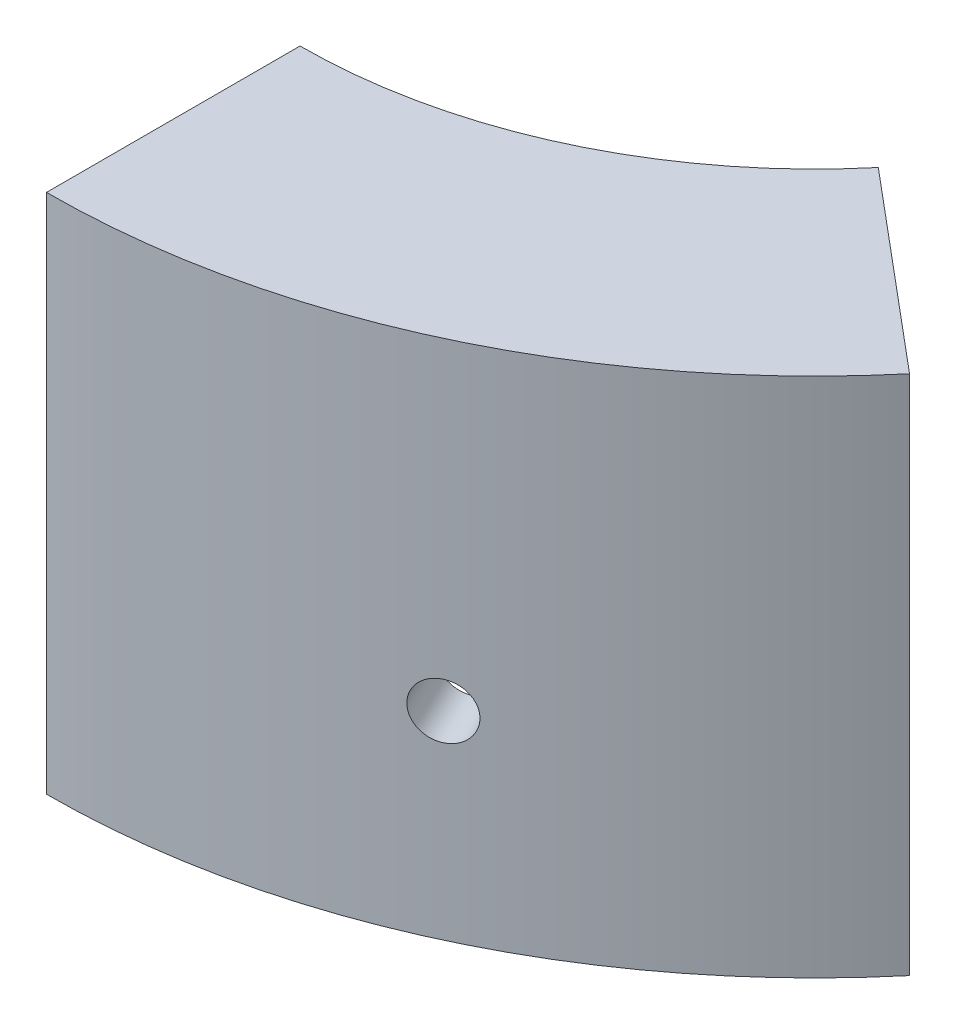
ISO-10303-21;
HEADER;
FILE_DESCRIPTION(('STEP AP214'),'2;1');
FILE_NAME('part.step','',(''),(''),'','','');
FILE_SCHEMA(('AUTOMOTIVE_DESIGN { 1 0 10303 214 1 1 1 1 }'));
ENDSEC;
DATA;
#1=APPLICATION_CONTEXT('core data for automotive mechanical design processes');
#2=APPLICATION_PROTOCOL_DEFINITION('international standard','automotive_design',2000,#1);
#3=PRODUCT_CONTEXT('',#1,'mechanical');
#4=PRODUCT('Part','Part','',(#3));
#5=PRODUCT_RELATED_PRODUCT_CATEGORY('part','',(#4));
#6=PRODUCT_DEFINITION_FORMATION('','',#4);
#7=PRODUCT_DEFINITION_CONTEXT('part definition',#1,'design');
#8=PRODUCT_DEFINITION('design','',#6,#7);
#9=PRODUCT_DEFINITION_SHAPE('','',#8);
#10=(LENGTH_UNIT() NAMED_UNIT(*) SI_UNIT(.MILLI.,.METRE.));
#11=(NAMED_UNIT(*) PLANE_ANGLE_UNIT() SI_UNIT($,.RADIAN.));
#12=(NAMED_UNIT(*) SI_UNIT($,.STERADIAN.) SOLID_ANGLE_UNIT());
#13=UNCERTAINTY_MEASURE_WITH_UNIT(LENGTH_MEASURE(1.E-05),#10,'distance_accuracy_value','');
#14=(GEOMETRIC_REPRESENTATION_CONTEXT(3) GLOBAL_UNCERTAINTY_ASSIGNED_CONTEXT((#13)) GLOBAL_UNIT_ASSIGNED_CONTEXT((#10,
#11,#12)) REPRESENTATION_CONTEXT('',''));
#15=CARTESIAN_POINT('',(0.,0.,0.));
#16=DIRECTION('',(0.,0.,1.));
#17=DIRECTION('',(1.,0.,0.));
#18=AXIS2_PLACEMENT_3D('',#15,#16,#17);
#19=CARTESIAN_POINT('',(0.,11.25,0.));
#20=DIRECTION('',(0.,-1.,0.));
#21=DIRECTION('',(0.,0.,-1.));
#22=AXIS2_PLACEMENT_3D('',#19,#20,#21);
#23=CYLINDRICAL_SURFACE('',#22,60.);
#24=DIRECTION('',(0.,-1.,0.));
#25=VECTOR('',#24,1.);
#26=CARTESIAN_POINT('',(0.,11.25,60.));
#27=LINE('',#26,#25);
#28=CARTESIAN_POINT('',(0.,11.25,60.));
#29=VERTEX_POINT('',#28);
#30=CARTESIAN_POINT('',(0.,-29.45,60.));
#31=VERTEX_POINT('',#30);
#32=EDGE_CURVE('E188',#29,#31,#27,.T.);
#33=ORIENTED_EDGE('',*,*,#32,.T.);
#34=CARTESIAN_POINT('',(0.,-29.45,0.));
#35=DIRECTION('',(0.,-1.,0.));
#36=DIRECTION('',(0.,0.,-1.));
#37=AXIS2_PLACEMENT_3D('',#34,#35,#36);
#38=CIRCLE('',#37,60.);
#39=CARTESIAN_POINT('',(45.9626665871388,-29.45,38.5672565811923));
#40=VERTEX_POINT('',#39);
#41=EDGE_CURVE('E145',#40,#31,#38,.T.);
#42=ORIENTED_EDGE('',*,*,#41,.F.);
#43=DIRECTION('',(0.,-1.,0.));
#44=VECTOR('',#43,1.);
#45=CARTESIAN_POINT('',(45.9626665871387,11.25,38.5672565811923));
#46=LINE('',#45,#44);
#47=CARTESIAN_POINT('',(45.9626665871387,11.25,38.5672565811923));
#48=VERTEX_POINT('',#47);
#49=EDGE_CURVE('E141',#48,#40,#46,.T.);
#50=ORIENTED_EDGE('',*,*,#49,.F.);
#51=CARTESIAN_POINT('',(0.,11.25,0.));
#52=DIRECTION('',(0.,1.,0.));
#53=DIRECTION('',(0.,0.,1.));
#54=AXIS2_PLACEMENT_3D('',#51,#52,#53);
#55=CIRCLE('',#54,60.);
#56=EDGE_CURVE('E166',#29,#48,#55,.T.);
#57=ORIENTED_EDGE('',*,*,#56,.F.);
#58=EDGE_LOOP('',(#33,#42,#50,#57));
#59=FACE_BOUND('',#58,.T.);
#60=CARTESIAN_POINT('',(23.3922491254643,-13.95,55.2521735396194));
#61=CARTESIAN_POINT('',(23.3922541854339,-14.0707248420507,55.2521717531925));
#62=CARTESIAN_POINT('',(23.4016513651294,-14.1915362342641,55.2481958127734));
#63=CARTESIAN_POINT('',(23.4389939015818,-14.429828956038,55.2323633417633));
#64=CARTESIAN_POINT('',(23.4669613419157,-14.5473061469481,55.220497428468));
#65=CARTESIAN_POINT('',(23.5406066530726,-14.7754439014427,55.1891423282363));
#66=CARTESIAN_POINT('',(23.5862757723697,-14.8861078021664,55.1696569082626));
#67=CARTESIAN_POINT('',(23.6939568640016,-15.0975036637949,55.1234961061498));
#68=CARTESIAN_POINT('',(23.7559648785194,-15.198238021852,55.0968224651981));
#69=CARTESIAN_POINT('',(23.8945332200248,-15.3870054728275,55.0368691597757));
#70=CARTESIAN_POINT('',(23.9711008917726,-15.4750321156179,55.003586160773));
#71=CARTESIAN_POINT('',(24.1365230414772,-15.635830823503,54.9311968676657));
#72=CARTESIAN_POINT('',(24.2253780114072,-15.7086022774988,54.8920903403871));
#73=CARTESIAN_POINT('',(24.4128028804114,-15.8368381175184,54.8089915117414));
#74=CARTESIAN_POINT('',(24.5113752076527,-15.8922981632809,54.7649979888648));
#75=CARTESIAN_POINT('',(24.7153552405868,-15.9843088158283,54.6732449126882));
#76=CARTESIAN_POINT('',(24.8207629130422,-16.0208595145535,54.6254853777004));
#77=CARTESIAN_POINT('',(25.0353281996155,-16.0739987719034,54.5274815035325));
#78=CARTESIAN_POINT('',(25.1444841696664,-16.0905959702895,54.4772382496084));
#79=CARTESIAN_POINT('',(25.363466769589,-16.1033837281213,54.3756298426833));
#80=CARTESIAN_POINT('',(25.4732933961575,-16.0995743879957,54.324264695205));
#81=CARTESIAN_POINT('',(25.6904517219533,-16.0716644472431,54.2219060594013));
#82=CARTESIAN_POINT('',(25.7977845433253,-16.0475731620519,54.170912411291));
#83=CARTESIAN_POINT('',(26.006992899415,-15.9797976151706,54.0707848874392));
#84=CARTESIAN_POINT('',(26.1088684195068,-15.9361133009727,54.0216510166822));
#85=CARTESIAN_POINT('',(26.3043498333329,-15.8303810610633,53.9267373565924));
#86=CARTESIAN_POINT('',(26.3979538006695,-15.7683288721379,53.8809583490097));
#87=CARTESIAN_POINT('',(26.5742832138732,-15.6276254653688,53.7942110526802));
#88=CARTESIAN_POINT('',(26.6570086223979,-15.5489741905486,53.7532427804469));
#89=CARTESIAN_POINT('',(26.8093585088674,-15.3772525227586,53.6774213048454));
#90=CARTESIAN_POINT('',(26.8789755951441,-15.2841740480264,53.6425715524008));
#91=CARTESIAN_POINT('',(27.0031533694194,-15.0862686136449,53.580169404268));
#92=CARTESIAN_POINT('',(27.0577140546456,-14.9814416518322,53.5526170099235));
#93=CARTESIAN_POINT('',(27.1502977204834,-14.76301022928,53.5057383827682));
#94=CARTESIAN_POINT('',(27.188320455097,-14.649405638005,53.4864122723213));
#95=CARTESIAN_POINT('',(27.2467957832979,-14.4166458929549,53.4566479052023));
#96=CARTESIAN_POINT('',(27.2672484449549,-14.2974907606855,53.4462096140972));
#97=CARTESIAN_POINT('',(27.2900232689762,-14.05708331066,53.4345842785768));
#98=CARTESIAN_POINT('',(27.2923555089991,-13.9358321961957,53.4333920919483));
#99=CARTESIAN_POINT('',(27.2788529381853,-13.6946122999907,53.4402866537407));
#100=CARTESIAN_POINT('',(27.263018157751,-13.5746435161043,53.4483733866334));
#101=CARTESIAN_POINT('',(27.2136166684765,-13.3394253603243,53.4735432535675));
#102=CARTESIAN_POINT('',(27.1800545523551,-13.2241747743903,53.4906240574616));
#103=CARTESIAN_POINT('',(27.0961095525794,-13.0016272536743,53.5331957681874));
#104=CARTESIAN_POINT('',(27.0457266197751,-12.894330342134,53.5586866995931));
#105=CARTESIAN_POINT('',(26.929479694029,-12.6906838732884,53.6172299205547));
#106=CARTESIAN_POINT('',(26.8636088615042,-12.5943391805383,53.6502855505705));
#107=CARTESIAN_POINT('',(26.7181903019912,-12.4153809036256,53.7228526098402));
#108=CARTESIAN_POINT('',(26.6386425275199,-12.3327673671364,53.7623640615071));
#109=CARTESIAN_POINT('',(26.4680066288881,-12.1835787012585,53.8465752296335));
#110=CARTESIAN_POINT('',(26.3769132852548,-12.1170108654874,53.8912772918713));
#111=CARTESIAN_POINT('',(26.1857261034243,-12.0018530746926,53.9844333222458));
#112=CARTESIAN_POINT('',(26.0856322900676,-11.9532630700535,54.0328872800275));
#113=CARTESIAN_POINT('',(25.8792526677646,-11.8754530241962,54.1320364768231));
#114=CARTESIAN_POINT('',(25.772968371504,-11.8462282723728,54.1827311675749));
#115=CARTESIAN_POINT('',(25.5571679252394,-11.8079628745986,54.2848543488288));
#116=CARTESIAN_POINT('',(25.4476517817606,-11.7989221878986,54.3362828378491));
#117=CARTESIAN_POINT('',(25.22855067912,-11.8012820814146,54.4383580677768));
#118=CARTESIAN_POINT('',(25.1189657931168,-11.8126711877716,54.4890052313837));
#119=CARTESIAN_POINT('',(24.9027912327665,-11.8555437355981,54.5881409727783));
#120=CARTESIAN_POINT('',(24.7962015642937,-11.8870272164737,54.6366295463327));
#121=CARTESIAN_POINT('',(24.5890790970899,-11.9691929072669,54.7301572492786));
#122=CARTESIAN_POINT('',(24.4885463901186,-12.0198754079545,54.775196326415));
#123=CARTESIAN_POINT('',(24.2964509051454,-12.1389974023433,54.8606738936362));
#124=CARTESIAN_POINT('',(24.2048878147176,-12.2074362772588,54.9011125439692));
#125=CARTESIAN_POINT('',(24.0333533285727,-12.3601654899175,54.9764196972454));
#126=CARTESIAN_POINT('',(23.9533872218165,-12.444463020206,55.0112856594244));
#127=CARTESIAN_POINT('',(23.8074220173936,-12.6265269797352,55.0746130780009));
#128=CARTESIAN_POINT('',(23.741426377667,-12.7242967337284,55.1030729488865));
#129=CARTESIAN_POINT('',(23.6253342186177,-12.9305772731139,55.1529472524422));
#130=CARTESIAN_POINT('',(23.5752492183618,-13.0390957662096,55.1743565810336));
#131=CARTESIAN_POINT('',(23.4925766984614,-13.2636557336775,55.2096085748595));
#132=CARTESIAN_POINT('',(23.4599683610407,-13.3796880721617,55.2234602429517));
#133=CARTESIAN_POINT('',(23.4218401466654,-13.5720421027067,55.2396383125264));
#134=CARTESIAN_POINT('',(23.4107580872576,-13.6471158642979,55.2443342925273));
#135=CARTESIAN_POINT('',(23.395960986367,-13.7981149961081,55.250602467416));
#136=CARTESIAN_POINT('',(23.3922459417497,-13.8740403659648,55.2521746636328));
#137=CARTESIAN_POINT('',(23.3922491254643,-13.95,55.2521735396194));
#138=B_SPLINE_CURVE_WITH_KNOTS('',3,(#60,#61,#62,#63,#64,#65,#66,#67,#68,#69,#70,#71,#72,#73,
#74,#75,#76,#77,#78,#79,#80,#81,#82,#83,#84,#85,#86,#87,#88,#89,#90,#91,#92,#93,#94,#95,#96,#97,
#98,#99,#100,#101,#102,#103,#104,#105,#106,#107,#108,#109,#110,#111,#112,#113,#114,#115,#116,
#117,#118,#119,#120,#121,#122,#123,#124,#125,#126,#127,#128,#129,#130,#131,#132,#133,#134,#135,
#136,#137),.UNSPECIFIED.,.T.,.F.,(4,2,2,2,2,2,2,2,2,2,2,2,2,2,2,2,2,2,2,2,2,2,2,2,2,2,2,2,2,2,2,
2,2,2,2,2,2,2,4),(0.,0.361897258983271,0.724225655357458,1.08637514835407,1.44843699736979,
1.81068197887757,2.17294146857741,2.53529171001089,2.89764018962249,3.25983171766565,
3.62202146322321,3.98404494682679,4.34606940062871,4.70817794687758,5.0702877360895,
5.43260110831141,5.79491454724963,6.15723337532553,6.51955079970539,6.88166670709438,
7.24378200848347,7.60580354064339,7.96782613063113,8.3300088940218,8.69219291485194,
9.05454125827568,9.41688860167997,9.77914777156539,10.1414062100911,10.5034612593326,
10.8655170185841,11.2275782614049,11.5896268885744,11.9518401171281,12.314142895364,
12.676707380773,13.0388390228668,13.2665435663525,13.4942480129583),.UNSPECIFIED.);
#139=CARTESIAN_POINT('',(23.3922491254643,-13.95,55.2521735396194));
#140=VERTEX_POINT('',#139);
#141=EDGE_CURVE('E152',#140,#140,#138,.T.);
#142=ORIENTED_EDGE('',*,*,#141,.F.);
#143=EDGE_LOOP('',(#142));
#144=FACE_BOUND('',#143,.T.);
#145=ADVANCED_FACE('F39',(#59,#144),#23,.T.);
#146=CARTESIAN_POINT('',(0.,-29.45,0.));
#147=DIRECTION('',(0.,1.,0.));
#148=DIRECTION('',(0.,0.,1.));
#149=AXIS2_PLACEMENT_3D('',#146,#147,#148);
#150=CYLINDRICAL_SURFACE('',#149,55.2);
#151=CARTESIAN_POINT('',(0.,6.25,0.));
#152=DIRECTION('',(0.,-1.,0.));
#153=DIRECTION('',(0.,0.,-1.));
#154=AXIS2_PLACEMENT_3D('',#151,#152,#153);
#155=CIRCLE('',#154,55.2);
#156=CARTESIAN_POINT('',(42.2856532601677,6.25,35.4818760546969));
#157=VERTEX_POINT('',#156);
#158=CARTESIAN_POINT('',(0.,6.25,55.2));
#159=VERTEX_POINT('',#158);
#160=EDGE_CURVE('E131',#157,#159,#155,.T.);
#161=ORIENTED_EDGE('',*,*,#160,.F.);
#162=DIRECTION('',(0.,1.,0.));
#163=VECTOR('',#162,1.);
#164=CARTESIAN_POINT('',(42.2856532601677,-29.45,35.4818760546969));
#165=LINE('',#164,#163);
#166=CARTESIAN_POINT('',(42.2856532601677,-29.45,35.4818760546969));
#167=VERTEX_POINT('',#166);
#168=EDGE_CURVE('E124',#167,#157,#165,.T.);
#169=ORIENTED_EDGE('',*,*,#168,.F.);
#170=CARTESIAN_POINT('',(0.,-29.45,0.));
#171=DIRECTION('',(0.,-1.,0.));
#172=DIRECTION('',(0.,0.,-1.));
#173=AXIS2_PLACEMENT_3D('',#170,#171,#172);
#174=CIRCLE('',#173,55.2);
#175=CARTESIAN_POINT('',(0.,-29.45,55.2));
#176=VERTEX_POINT('',#175);
#177=EDGE_CURVE('E129',#167,#176,#174,.T.);
#178=ORIENTED_EDGE('',*,*,#177,.T.);
#179=DIRECTION('',(0.,1.,0.));
#180=VECTOR('',#179,1.);
#181=CARTESIAN_POINT('',(0.,-29.45,55.2));
#182=LINE('',#181,#180);
#183=EDGE_CURVE('E134',#176,#159,#182,.T.);
#184=ORIENTED_EDGE('',*,*,#183,.T.);
#185=EDGE_LOOP('',(#161,#169,#178,#184));
#186=FACE_BOUND('',#185,.T.);
#187=CARTESIAN_POINT('',(21.362264364066,-13.95,50.898857170272));
#188=CARTESIAN_POINT('',(21.3622694405158,-14.0707172908338,50.8988554256321));
#189=CARTESIAN_POINT('',(21.3716789911995,-14.1915209472526,50.8949090210859));
#190=CARTESIAN_POINT('',(21.4090693215218,-14.4297978923482,50.8791916819157));
#191=CARTESIAN_POINT('',(21.4370721682093,-14.5472670505989,50.8674114498586));
#192=CARTESIAN_POINT('',(21.5108063948959,-14.7753886985463,50.8362744564914));
#193=CARTESIAN_POINT('',(21.556528961326,-14.8860445454403,50.8169214617335));
#194=CARTESIAN_POINT('',(21.6643282349254,-15.0974258952511,50.7710576658738));
#195=CARTESIAN_POINT('',(21.726401000763,-15.1981537833423,50.7445485897579));
#196=CARTESIAN_POINT('',(21.8651074100081,-15.386918079417,50.6849362480143));
#197=CARTESIAN_POINT('',(21.9417494579048,-15.4749471100826,50.6518291757064));
#198=CARTESIAN_POINT('',(22.1073176286763,-15.6357523274736,50.5797849021829));
#199=CARTESIAN_POINT('',(22.1962442451878,-15.7085279009658,50.5408474666776));
#200=CARTESIAN_POINT('',(22.3838065423846,-15.8367769812635,50.4580588232859));
#201=CARTESIAN_POINT('',(22.4824451223515,-15.8922453006613,50.4142061475244));
#202=CARTESIAN_POINT('',(22.6865409113032,-15.9842718698095,50.3226922596357));
#203=CARTESIAN_POINT('',(22.791998083599,-16.0208302213001,50.2750310680008));
#204=CARTESIAN_POINT('',(23.0066314595807,-16.0739811439652,50.1771741441197));
#205=CARTESIAN_POINT('',(23.1158057314189,-16.090583928341,50.126979722092));
#206=CARTESIAN_POINT('',(23.3347991188611,-16.1033839191848,50.0254107089069));
#207=CARTESIAN_POINT('',(23.4446182309236,-16.0995812376133,49.9740361242263));
#208=CARTESIAN_POINT('',(23.6617267213326,-16.0716867802583,49.8716060703064));
#209=CARTESIAN_POINT('',(23.7690174395056,-16.04760601046,49.8205504430922));
#210=CARTESIAN_POINT('',(23.9781204132354,-15.9798559848806,49.7202493672024));
#211=CARTESIAN_POINT('',(24.0799326525108,-15.9361866708882,49.6710039239064));
#212=CARTESIAN_POINT('',(24.2752775540777,-15.8304865683802,49.5758279947255));
#213=CARTESIAN_POINT('',(24.3688079378394,-15.7684507470791,49.5298984217509));
#214=CARTESIAN_POINT('',(24.5449845787538,-15.6277823033014,49.4428296484158));
#215=CARTESIAN_POINT('',(24.6276307909703,-15.5491496123071,49.4016904678329));
#216=CARTESIAN_POINT('',(24.7798343877172,-15.3774572583098,49.3255215086198));
#217=CARTESIAN_POINT('',(24.849383042005,-15.2843880474035,49.2904958060887));
#218=CARTESIAN_POINT('',(24.9734345471749,-15.0864981667477,49.2277606111358));
#219=CARTESIAN_POINT('',(25.0279373950865,-14.981677494678,49.2000511201583));
#220=CARTESIAN_POINT('',(25.120423476875,-14.763254589533,49.1528944476081));
#221=CARTESIAN_POINT('',(25.1584064139596,-14.6496521987308,49.1334474144767));
#222=CARTESIAN_POINT('',(25.216825013252,-14.4168931317498,49.1034909472003));
#223=CARTESIAN_POINT('',(25.2372607556765,-14.2977364809648,49.0929814721975));
#224=CARTESIAN_POINT('',(25.2600260401029,-14.0573351819678,49.0812719054578));
#225=CARTESIAN_POINT('',(25.2623674707566,-13.9360919572149,49.0800657011189));
#226=CARTESIAN_POINT('',(25.2489123611905,-13.6948854804683,49.0869889035784));
#227=CARTESIAN_POINT('',(25.2331158569941,-13.574922225933,49.0951182918356));
#228=CARTESIAN_POINT('',(25.1838184577965,-13.339718375219,49.1204239319036));
#229=CARTESIAN_POINT('',(25.1503229870618,-13.2244763437634,49.1375974119335));
#230=CARTESIAN_POINT('',(25.0665337704626,-13.0019421093365,49.1803932988871));
#231=CARTESIAN_POINT('',(25.0162399662586,-12.8946499339761,49.2060157351536));
#232=CARTESIAN_POINT('',(24.9001810184495,-12.690999539408,49.2648475496869));
#233=CARTESIAN_POINT('',(24.8344078033248,-12.5946470635407,49.2980608858593));
#234=CARTESIAN_POINT('',(24.6891866292014,-12.4156688832327,49.3709494187668));
#235=CARTESIAN_POINT('',(24.6097386150886,-12.3330432341184,49.4106246415456));
#236=CARTESIAN_POINT('',(24.4392869135116,-12.1838194413456,49.4951542324858));
#237=CARTESIAN_POINT('',(24.348277051962,-12.1172299164808,49.5400113666452));
#238=CARTESIAN_POINT('',(24.157237498651,-12.0020275133764,49.6334480778319));
#239=CARTESIAN_POINT('',(24.0572078345509,-11.9534145800098,49.6820276434435));
#240=CARTESIAN_POINT('',(23.8509347435121,-11.8755604131166,49.781382084593));
#241=CARTESIAN_POINT('',(23.7446931082972,-11.8463136235015,49.8321563260278));
#242=CARTESIAN_POINT('',(23.5289482098183,-11.8080037451981,49.9343853426438));
#243=CARTESIAN_POINT('',(23.4194449554035,-11.7989406017547,49.9858401159784));
#244=CARTESIAN_POINT('',(23.2003503259431,-11.8012559096318,50.0879061311319));
#245=CARTESIAN_POINT('',(23.0907590574566,-11.8126208120851,50.1385179095972));
#246=CARTESIAN_POINT('',(22.874542823071,-11.8554416696801,50.2375301448695));
#247=CARTESIAN_POINT('',(22.7679178629521,-11.8868976639688,50.2859305973678));
#248=CARTESIAN_POINT('',(22.5607000357985,-11.969005384266,50.3792391456441));
#249=CARTESIAN_POINT('',(22.4601072531721,-12.0196573788116,50.4241471925556));
#250=CARTESIAN_POINT('',(22.2678724858564,-12.1387160718354,50.5093350047404));
#251=CARTESIAN_POINT('',(22.1762301965425,-12.2071221657736,50.5496149275374));
#252=CARTESIAN_POINT('',(22.0045167398937,-12.3597926530076,50.6245991794193));
#253=CARTESIAN_POINT('',(21.9244520333264,-12.4440658408754,50.6593003965548));
#254=CARTESIAN_POINT('',(21.7782890954002,-12.6260847085943,50.7223074909036));
#255=CARTESIAN_POINT('',(21.7121943185973,-12.7238337109633,50.7506117863728));
#256=CARTESIAN_POINT('',(21.5959097870859,-12.9300825186774,50.8002036647812));
#257=CARTESIAN_POINT('',(21.54573227728,-13.0385905169322,50.8214858462216));
#258=CARTESIAN_POINT('',(21.4628934933082,-13.2631362674082,50.8565260806417));
#259=CARTESIAN_POINT('',(21.4302114078631,-13.3791648885453,50.8702930735277));
#260=CARTESIAN_POINT('',(21.3919671505231,-13.5716015509966,50.8863830453759));
#261=CARTESIAN_POINT('',(21.3808433136291,-13.6467614986251,50.8910562393931));
#262=CARTESIAN_POINT('',(21.3659903232497,-13.7979362058161,50.8972938505956));
#263=CARTESIAN_POINT('',(21.3622611660229,-13.8739509649459,50.8988582693539));
#264=CARTESIAN_POINT('',(21.362264364066,-13.95,50.898857170272));
#265=B_SPLINE_CURVE_WITH_KNOTS('',3,(#187,#188,#189,#190,#191,#192,#193,#194,#195,#196,#197,
#198,#199,#200,#201,#202,#203,#204,#205,#206,#207,#208,#209,#210,#211,#212,#213,#214,#215,#216,
#217,#218,#219,#220,#221,#222,#223,#224,#225,#226,#227,#228,#229,#230,#231,#232,#233,#234,#235,
#236,#237,#238,#239,#240,#241,#242,#243,#244,#245,#246,#247,#248,#249,#250,#251,#252,#253,#254,
#255,#256,#257,#258,#259,#260,#261,#262,#263,#264),.UNSPECIFIED.,.T.,.F.,(4,2,2,2,2,2,2,2,2,2,2,
2,2,2,2,2,2,2,2,2,2,2,2,2,2,2,2,2,2,2,2,2,2,2,2,2,2,2,4),(0.,0.361874276229291,
0.724178804587717,1.08630335796685,1.44834069841001,1.81058752230407,2.17284890677704,
2.535218765784,2.89758667513077,3.25976904655569,3.62194943076489,3.98393336723072,
4.34591837941309,4.70800267458691,5.07008846460504,5.43241475701872,5.79474112096662,
6.15707399410754,6.51940521084221,6.88149834191419,7.2435907538443,7.6055722583101,
7.96755501992841,8.32972695217412,8.69190034412904,9.05426795794163,9.41663446050763,
9.77889695611438,10.1411584689593,10.5031798011143,10.8652018386611,11.2272289408019,
11.589243717273,11.9514597396554,12.3137652281513,12.6763487604115,13.0385000259541,
13.2664723673809,13.4944445934643),.UNSPECIFIED.);
#266=CARTESIAN_POINT('',(21.362264364066,-13.95,50.898857170272));
#267=VERTEX_POINT('',#266);
#268=EDGE_CURVE('E43',#267,#267,#265,.T.);
#269=ORIENTED_EDGE('',*,*,#268,.T.);
#270=EDGE_LOOP('',(#269));
#271=FACE_BOUND('',#270,.T.);
#272=ADVANCED_FACE('F126',(#186,#271),#150,.F.);
#273=CARTESIAN_POINT('',(0.,6.25,0.));
#274=DIRECTION('',(0.,-1.,0.));
#275=DIRECTION('',(0.,0.,-1.));
#276=AXIS2_PLACEMENT_3D('',#273,#274,#275);
#277=CYLINDRICAL_SURFACE('',#276,43.2);
#278=CARTESIAN_POINT('',(0.,0.,0.));
#279=DIRECTION('',(0.,1.,0.));
#280=DIRECTION('',(0.,0.,1.));
#281=AXIS2_PLACEMENT_3D('',#278,#279,#280);
#282=CIRCLE('',#281,43.2);
#283=CARTESIAN_POINT('',(0.,0.,43.2));
#284=VERTEX_POINT('',#283);
#285=CARTESIAN_POINT('',(33.0931199427399,0.,27.7684247384584));
#286=VERTEX_POINT('',#285);
#287=EDGE_CURVE('E190',#284,#286,#282,.T.);
#288=ORIENTED_EDGE('',*,*,#287,.F.);
#289=DIRECTION('',(0.,-1.,0.));
#290=VECTOR('',#289,1.);
#291=CARTESIAN_POINT('',(0.,6.25,43.2));
#292=LINE('',#291,#290);
#293=CARTESIAN_POINT('',(0.,6.25,43.2));
#294=VERTEX_POINT('',#293);
#295=EDGE_CURVE('E11',#294,#284,#292,.T.);
#296=ORIENTED_EDGE('',*,*,#295,.F.);
#297=CARTESIAN_POINT('',(0.,6.25,0.));
#298=DIRECTION('',(0.,1.,0.));
#299=DIRECTION('',(0.,0.,1.));
#300=AXIS2_PLACEMENT_3D('',#297,#298,#299);
#301=CIRCLE('',#300,43.2);
#302=CARTESIAN_POINT('',(33.0931199427399,6.25,27.7684247384584));
#303=VERTEX_POINT('',#302);
#304=EDGE_CURVE('E191',#294,#303,#301,.T.);
#305=ORIENTED_EDGE('',*,*,#304,.T.);
#306=DIRECTION('',(0.,-1.,0.));
#307=VECTOR('',#306,1.);
#308=CARTESIAN_POINT('',(33.0931199427399,6.25,27.7684247384584));
#309=LINE('',#308,#307);
#310=EDGE_CURVE('E62',#303,#286,#309,.T.);
#311=ORIENTED_EDGE('',*,*,#310,.T.);
#312=EDGE_LOOP('',(#288,#296,#305,#311));
#313=FACE_BOUND('',#312,.T.);
#314=ADVANCED_FACE('F41',(#313),#277,.F.);
#315=CARTESIAN_POINT('',(0.,6.25,0.));
#316=DIRECTION('',(1.,0.,0.));
#317=DIRECTION('',(0.,0.,-1.));
#318=AXIS2_PLACEMENT_3D('',#315,#316,#317);
#319=PLANE('',#318);
#320=DIRECTION('',(0.,0.,1.));
#321=VECTOR('',#320,1.);
#322=CARTESIAN_POINT('',(0.,0.,0.));
#323=LINE('',#322,#321);
#324=CARTESIAN_POINT('',(0.,0.,46.8));
#325=VERTEX_POINT('',#324);
#326=EDGE_CURVE('E198',#284,#325,#323,.T.);
#327=ORIENTED_EDGE('',*,*,#326,.T.);
#328=DIRECTION('',(0.,-1.,0.));
#329=VECTOR('',#328,1.);
#330=CARTESIAN_POINT('',(0.,6.25,46.8));
#331=LINE('',#330,#329);
#332=CARTESIAN_POINT('',(0.,6.25,46.8));
#333=VERTEX_POINT('',#332);
#334=EDGE_CURVE('E54',#333,#325,#331,.T.);
#335=ORIENTED_EDGE('',*,*,#334,.F.);
#336=DIRECTION('',(0.,0.,1.));
#337=VECTOR('',#336,1.);
#338=CARTESIAN_POINT('',(0.,6.25,0.));
#339=LINE('',#338,#337);
#340=EDGE_CURVE('E133',#333,#159,#339,.T.);
#341=ORIENTED_EDGE('',*,*,#340,.T.);
#342=ORIENTED_EDGE('',*,*,#183,.F.);
#343=DIRECTION('',(0.,0.,-1.));
#344=VECTOR('',#343,1.);
#345=CARTESIAN_POINT('',(0.,-29.45,0.));
#346=LINE('',#345,#344);
#347=EDGE_CURVE('E149',#31,#176,#346,.T.);
#348=ORIENTED_EDGE('',*,*,#347,.F.);
#349=ORIENTED_EDGE('',*,*,#32,.F.);
#350=DIRECTION('',(0.,0.,1.));
#351=VECTOR('',#350,1.);
#352=CARTESIAN_POINT('',(0.,11.25,0.));
#353=LINE('',#352,#351);
#354=CARTESIAN_POINT('',(0.,11.25,40.2));
#355=VERTEX_POINT('',#354);
#356=EDGE_CURVE('E163',#355,#29,#353,.T.);
#357=ORIENTED_EDGE('',*,*,#356,.F.);
#358=DIRECTION('',(0.,-1.,0.));
#359=VECTOR('',#358,1.);
#360=CARTESIAN_POINT('',(0.,11.25,40.2));
#361=LINE('',#360,#359);
#362=CARTESIAN_POINT('',(0.,6.25,40.2));
#363=VERTEX_POINT('',#362);
#364=EDGE_CURVE('E174',#355,#363,#361,.T.);
#365=ORIENTED_EDGE('',*,*,#364,.T.);
#366=EDGE_CURVE('E175',#363,#294,#339,.T.);
#367=ORIENTED_EDGE('',*,*,#366,.T.);
#368=ORIENTED_EDGE('',*,*,#295,.T.);
#369=EDGE_LOOP('',(#327,#335,#341,#342,#348,#349,#357,#365,#367,#368));
#370=FACE_BOUND('',#369,.T.);
#371=ADVANCED_FACE('F218',(#370),#319,.F.);
#372=CARTESIAN_POINT('',(0.,6.25,0.));
#373=DIRECTION('',(0.,-1.,0.));
#374=DIRECTION('',(0.,0.,-1.));
#375=AXIS2_PLACEMENT_3D('',#372,#373,#374);
#376=CYLINDRICAL_SURFACE('',#375,46.8);
#377=CARTESIAN_POINT('',(0.,0.,0.));
#378=DIRECTION('',(0.,1.,0.));
#379=DIRECTION('',(0.,0.,1.));
#380=AXIS2_PLACEMENT_3D('',#377,#378,#379);
#381=CIRCLE('',#380,46.8);
#382=CARTESIAN_POINT('',(35.8508799379682,0.,30.08246013333));
#383=VERTEX_POINT('',#382);
#384=EDGE_CURVE('E200',#325,#383,#381,.T.);
#385=ORIENTED_EDGE('',*,*,#384,.T.);
#386=DIRECTION('',(0.,-1.,0.));
#387=VECTOR('',#386,1.);
#388=CARTESIAN_POINT('',(35.8508799379682,6.25,30.08246013333));
#389=LINE('',#388,#387);
#390=CARTESIAN_POINT('',(35.8508799379682,6.25,30.08246013333));
#391=VERTEX_POINT('',#390);
#392=EDGE_CURVE('E78',#391,#383,#389,.T.);
#393=ORIENTED_EDGE('',*,*,#392,.F.);
#394=CARTESIAN_POINT('',(0.,6.25,0.));
#395=DIRECTION('',(0.,1.,0.));
#396=DIRECTION('',(0.,0.,1.));
#397=AXIS2_PLACEMENT_3D('',#394,#395,#396);
#398=CIRCLE('',#397,46.8);
#399=EDGE_CURVE('E193',#333,#391,#398,.T.);
#400=ORIENTED_EDGE('',*,*,#399,.F.);
#401=ORIENTED_EDGE('',*,*,#334,.T.);
#402=EDGE_LOOP('',(#385,#393,#400,#401));
#403=FACE_BOUND('',#402,.T.);
#404=ADVANCED_FACE('F210',(#403),#376,.T.);
#405=CARTESIAN_POINT('',(0.,6.25,0.));
#406=DIRECTION('',(0.642787609686539,0.,-0.766044443118979));
#407=DIRECTION('',(-0.766044443118979,0.,-0.642787609686538));
#408=AXIS2_PLACEMENT_3D('',#405,#406,#407);
#409=PLANE('',#408);
#410=DIRECTION('',(0.766044443118979,0.,0.642787609686539));
#411=VECTOR('',#410,1.);
#412=CARTESIAN_POINT('',(0.,0.,0.));
#413=LINE('',#412,#411);
#414=EDGE_CURVE('E194',#286,#383,#413,.T.);
#415=ORIENTED_EDGE('',*,*,#414,.F.);
#416=ORIENTED_EDGE('',*,*,#310,.F.);
#417=DIRECTION('',(-0.766044443118978,0.,-0.642787609686539));
#418=VECTOR('',#417,1.);
#419=CARTESIAN_POINT('',(0.,6.25,0.));
#420=LINE('',#419,#418);
#421=CARTESIAN_POINT('',(30.794986613383,6.25,25.8400619093988));
#422=VERTEX_POINT('',#421);
#423=EDGE_CURVE('E178',#303,#422,#420,.T.);
#424=ORIENTED_EDGE('',*,*,#423,.T.);
#425=DIRECTION('',(0.,-1.,0.));
#426=VECTOR('',#425,1.);
#427=CARTESIAN_POINT('',(30.794986613383,11.25,25.8400619093988));
#428=LINE('',#427,#426);
#429=CARTESIAN_POINT('',(30.794986613383,11.25,25.8400619093988));
#430=VERTEX_POINT('',#429);
#431=EDGE_CURVE('E184',#430,#422,#428,.T.);
#432=ORIENTED_EDGE('',*,*,#431,.F.);
#433=DIRECTION('',(-0.766044443118978,0.,-0.642787609686539));
#434=VECTOR('',#433,1.);
#435=CARTESIAN_POINT('',(0.,11.25,0.));
#436=LINE('',#435,#434);
#437=EDGE_CURVE('E169',#48,#430,#436,.T.);
#438=ORIENTED_EDGE('',*,*,#437,.F.);
#439=ORIENTED_EDGE('',*,*,#49,.T.);
#440=DIRECTION('',(0.766044443118978,0.,0.642787609686539));
#441=VECTOR('',#440,1.);
#442=CARTESIAN_POINT('',(0.,-29.45,0.));
#443=LINE('',#442,#441);
#444=EDGE_CURVE('E137',#167,#40,#443,.T.);
#445=ORIENTED_EDGE('',*,*,#444,.F.);
#446=ORIENTED_EDGE('',*,*,#168,.T.);
#447=EDGE_CURVE('E179',#157,#391,#420,.T.);
#448=ORIENTED_EDGE('',*,*,#447,.T.);
#449=ORIENTED_EDGE('',*,*,#392,.T.);
#450=EDGE_LOOP('',(#415,#416,#424,#432,#438,#439,#445,#446,#448,#449));
#451=FACE_BOUND('',#450,.T.);
#452=ADVANCED_FACE('F138',(#451),#409,.T.);
#453=CARTESIAN_POINT('',(0.,0.,0.));
#454=DIRECTION('',(0.,1.,0.));
#455=DIRECTION('',(0.,0.,1.));
#456=AXIS2_PLACEMENT_3D('',#453,#454,#455);
#457=PLANE('',#456);
#458=ORIENTED_EDGE('',*,*,#287,.T.);
#459=ORIENTED_EDGE('',*,*,#414,.T.);
#460=ORIENTED_EDGE('',*,*,#384,.F.);
#461=ORIENTED_EDGE('',*,*,#326,.F.);
#462=EDGE_LOOP('',(#458,#459,#460,#461));
#463=FACE_BOUND('',#462,.T.);
#464=ADVANCED_FACE('F216',(#463),#457,.F.);
#465=CARTESIAN_POINT('',(0.,6.25,0.));
#466=DIRECTION('',(0.,1.,0.));
#467=DIRECTION('',(0.,0.,1.));
#468=AXIS2_PLACEMENT_3D('',#465,#466,#467);
#469=PLANE('',#468);
#470=ORIENTED_EDGE('',*,*,#304,.F.);
#471=ORIENTED_EDGE('',*,*,#366,.F.);
#472=CARTESIAN_POINT('',(0.,6.25,0.));
#473=DIRECTION('',(0.,1.,0.));
#474=DIRECTION('',(0.,0.,1.));
#475=AXIS2_PLACEMENT_3D('',#472,#473,#474);
#476=CIRCLE('',#475,40.2);
#477=EDGE_CURVE('E167',#363,#422,#476,.T.);
#478=ORIENTED_EDGE('',*,*,#477,.T.);
#479=ORIENTED_EDGE('',*,*,#423,.F.);
#480=EDGE_LOOP('',(#470,#471,#478,#479));
#481=FACE_BOUND('',#480,.T.);
#482=ADVANCED_FACE('F235',(#481),#469,.F.);
#483=CARTESIAN_POINT('',(0.,11.25,0.));
#484=DIRECTION('',(0.,-1.,0.));
#485=DIRECTION('',(0.,0.,-1.));
#486=AXIS2_PLACEMENT_3D('',#483,#484,#485);
#487=CYLINDRICAL_SURFACE('',#486,40.2);
#488=ORIENTED_EDGE('',*,*,#477,.F.);
#489=ORIENTED_EDGE('',*,*,#364,.F.);
#490=CARTESIAN_POINT('',(0.,11.25,0.));
#491=DIRECTION('',(0.,1.,0.));
#492=DIRECTION('',(0.,0.,1.));
#493=AXIS2_PLACEMENT_3D('',#490,#491,#492);
#494=CIRCLE('',#493,40.2);
#495=EDGE_CURVE('E171',#355,#430,#494,.T.);
#496=ORIENTED_EDGE('',*,*,#495,.T.);
#497=ORIENTED_EDGE('',*,*,#431,.T.);
#498=EDGE_LOOP('',(#488,#489,#496,#497));
#499=FACE_BOUND('',#498,.T.);
#500=ADVANCED_FACE('F231',(#499),#487,.F.);
#501=CARTESIAN_POINT('',(0.,11.25,0.));
#502=DIRECTION('',(0.,1.,0.));
#503=DIRECTION('',(0.,0.,1.));
#504=AXIS2_PLACEMENT_3D('',#501,#502,#503);
#505=PLANE('',#504);
#506=ORIENTED_EDGE('',*,*,#356,.T.);
#507=ORIENTED_EDGE('',*,*,#56,.T.);
#508=ORIENTED_EDGE('',*,*,#437,.T.);
#509=ORIENTED_EDGE('',*,*,#495,.F.);
#510=EDGE_LOOP('',(#506,#507,#508,#509));
#511=FACE_BOUND('',#510,.T.);
#512=ADVANCED_FACE('F265',(#511),#505,.T.);
#513=ORIENTED_EDGE('',*,*,#447,.F.);
#514=ORIENTED_EDGE('',*,*,#160,.T.);
#515=ORIENTED_EDGE('',*,*,#340,.F.);
#516=ORIENTED_EDGE('',*,*,#399,.T.);
#517=EDGE_LOOP('',(#513,#514,#515,#516));
#518=FACE_BOUND('',#517,.T.);
#519=ADVANCED_FACE('F259',(#518),#469,.F.);
#520=CARTESIAN_POINT('',(0.,-29.45,0.));
#521=DIRECTION('',(0.,-1.,0.));
#522=DIRECTION('',(0.,0.,-1.));
#523=AXIS2_PLACEMENT_3D('',#520,#521,#522);
#524=PLANE('',#523);
#525=ORIENTED_EDGE('',*,*,#177,.F.);
#526=ORIENTED_EDGE('',*,*,#444,.T.);
#527=ORIENTED_EDGE('',*,*,#41,.T.);
#528=ORIENTED_EDGE('',*,*,#347,.T.);
#529=EDGE_LOOP('',(#525,#526,#527,#528));
#530=FACE_BOUND('',#529,.T.);
#531=ADVANCED_FACE('F147',(#530),#524,.T.);
#532=CARTESIAN_POINT('',(31.1905502919557,-13.95,66.8883509556001));
#533=DIRECTION('',(-0.422618261740701,0.,-0.906307787036649));
#534=DIRECTION('',(-0.906307787036649,0.,0.422618261740701));
#535=AXIS2_PLACEMENT_3D('',#532,#533,#534);
#536=CYLINDRICAL_SURFACE('',#535,2.15);
#537=ORIENTED_EDGE('',*,*,#268,.F.);
#538=EDGE_LOOP('',(#537));
#539=FACE_BOUND('',#538,.T.);
#540=ORIENTED_EDGE('',*,*,#141,.T.);
#541=EDGE_LOOP('',(#540));
#542=FACE_BOUND('',#541,.T.);
#543=ADVANCED_FACE('F284',(#539,#542),#536,.F.);
#544=CLOSED_SHELL('',(#145,#272,#314,#371,#404,#452,#464,#482,#500,#512,#519,#531,#543));
#545=MANIFOLD_SOLID_BREP('B2',#544);
#546=ADVANCED_BREP_SHAPE_REPRESENTATION('',(#18,#545),#14);
#547=SHAPE_DEFINITION_REPRESENTATION(#9,#546);
ENDSEC;
END-ISO-10303-21;
